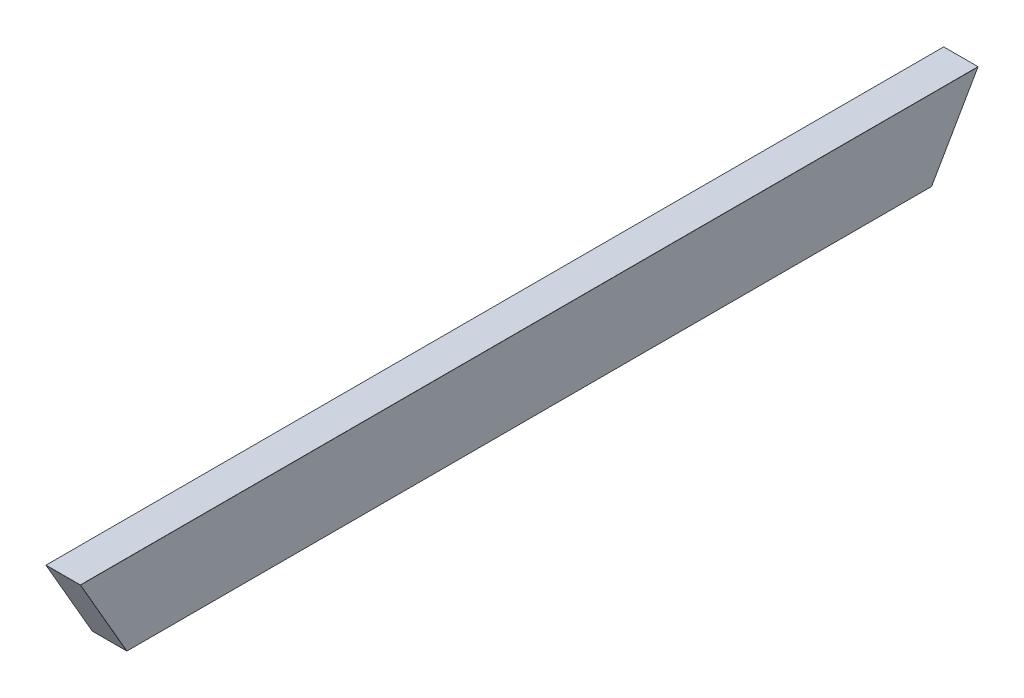
ISO-10303-21;
HEADER;
FILE_DESCRIPTION(('STEP AP214'),'2;1');
FILE_NAME('part.step','',(''),(''),'','','');
FILE_SCHEMA(('AUTOMOTIVE_DESIGN { 1 0 10303 214 1 1 1 1 }'));
ENDSEC;
DATA;
#1=APPLICATION_CONTEXT('core data for automotive mechanical design processes');
#2=APPLICATION_PROTOCOL_DEFINITION('international standard','automotive_design',2000,#1);
#3=PRODUCT_CONTEXT('',#1,'mechanical');
#4=PRODUCT('Part','Part','',(#3));
#5=PRODUCT_RELATED_PRODUCT_CATEGORY('part','',(#4));
#6=PRODUCT_DEFINITION_FORMATION('','',#4);
#7=PRODUCT_DEFINITION_CONTEXT('part definition',#1,'design');
#8=PRODUCT_DEFINITION('design','',#6,#7);
#9=PRODUCT_DEFINITION_SHAPE('','',#8);
#10=(LENGTH_UNIT() NAMED_UNIT(*) SI_UNIT(.MILLI.,.METRE.));
#11=(NAMED_UNIT(*) PLANE_ANGLE_UNIT() SI_UNIT($,.RADIAN.));
#12=(NAMED_UNIT(*) SI_UNIT($,.STERADIAN.) SOLID_ANGLE_UNIT());
#13=UNCERTAINTY_MEASURE_WITH_UNIT(LENGTH_MEASURE(1.E-05),#10,'distance_accuracy_value','');
#14=(GEOMETRIC_REPRESENTATION_CONTEXT(3) GLOBAL_UNCERTAINTY_ASSIGNED_CONTEXT((#13)) GLOBAL_UNIT_ASSIGNED_CONTEXT((#10,
#11,#12)) REPRESENTATION_CONTEXT('',''));
#15=CARTESIAN_POINT('',(0.,0.,0.));
#16=DIRECTION('',(0.,0.,1.));
#17=DIRECTION('',(1.,0.,0.));
#18=AXIS2_PLACEMENT_3D('',#15,#16,#17);
#19=CARTESIAN_POINT('',(-1.5,3.5,39.));
#20=DIRECTION('',(1.,0.,0.));
#21=DIRECTION('',(0.,1.,0.));
#22=AXIS2_PLACEMENT_3D('',#19,#20,#21);
#23=PLANE('',#22);
#24=DIRECTION('',(0.,0.,1.));
#25=VECTOR('',#24,1.);
#26=CARTESIAN_POINT('',(-1.5,-3.49,39.));
#27=LINE('',#26,#25);
#28=CARTESIAN_POINT('',(-1.5,-3.49,-34.9527746129807));
#29=VERTEX_POINT('',#28);
#30=CARTESIAN_POINT('',(-1.5,-3.49,34.9527746129807));
#31=VERTEX_POINT('',#30);
#32=EDGE_CURVE('E299',#29,#31,#27,.T.);
#33=ORIENTED_EDGE('',*,*,#32,.T.);
#34=DIRECTION('',(0.,0.866025403784438,0.500000000000001));
#35=VECTOR('',#34,1.);
#36=CARTESIAN_POINT('',(-1.5,3.505,38.9913397459622));
#37=LINE('',#36,#35);
#38=CARTESIAN_POINT('',(-1.5,3.49,38.9826794919243));
#39=VERTEX_POINT('',#38);
#40=EDGE_CURVE('E266',#31,#39,#37,.T.);
#41=ORIENTED_EDGE('',*,*,#40,.T.);
#42=DIRECTION('',(0.,0.,-1.));
#43=VECTOR('',#42,1.);
#44=CARTESIAN_POINT('',(-1.5,3.49,39.));
#45=LINE('',#44,#43);
#46=CARTESIAN_POINT('',(-1.5,3.49,-38.9826794919243));
#47=VERTEX_POINT('',#46);
#48=EDGE_CURVE('E342',#39,#47,#45,.T.);
#49=ORIENTED_EDGE('',*,*,#48,.T.);
#50=DIRECTION('',(0.,-0.866025403784438,0.500000000000001));
#51=VECTOR('',#50,1.);
#52=CARTESIAN_POINT('',(-1.5,-3.48499999999999,-34.9556613643267));
#53=LINE('',#52,#51);
#54=EDGE_CURVE('E264',#47,#29,#53,.T.);
#55=ORIENTED_EDGE('',*,*,#54,.T.);
#56=EDGE_LOOP('',(#33,#41,#49,#55));
#57=FACE_BOUND('',#56,.T.);
#58=ADVANCED_FACE('F34',(#57),#23,.F.);
#59=CARTESIAN_POINT('',(1.5,-3.5,39.));
#60=DIRECTION('',(0.,1.,0.));
#61=DIRECTION('',(0.,0.,1.));
#62=AXIS2_PLACEMENT_3D('',#59,#60,#61);
#63=PLANE('',#62);
#64=DIRECTION('',(0.,0.,1.));
#65=VECTOR('',#64,1.);
#66=CARTESIAN_POINT('',(1.49,-3.5,39.));
#67=LINE('',#66,#65);
#68=CARTESIAN_POINT('',(1.49,-3.5,-34.931227607597));
#69=VERTEX_POINT('',#68);
#70=CARTESIAN_POINT('',(1.49,-3.5,34.9485481156726));
#71=VERTEX_POINT('',#70);
#72=EDGE_CURVE('E345',#69,#71,#67,.T.);
#73=ORIENTED_EDGE('',*,*,#72,.T.);
#74=DIRECTION('',(-1.,0.,0.));
#75=VECTOR('',#74,1.);
#76=CARTESIAN_POINT('',(1.5,-3.5,34.9485481156726));
#77=LINE('',#76,#75);
#78=CARTESIAN_POINT('',(-1.49,-3.5,34.9485481156726));
#79=VERTEX_POINT('',#78);
#80=EDGE_CURVE('E251',#71,#79,#77,.T.);
#81=ORIENTED_EDGE('',*,*,#80,.T.);
#82=DIRECTION('',(0.,0.,-1.));
#83=VECTOR('',#82,1.);
#84=CARTESIAN_POINT('',(-1.49,-3.5,39.));
#85=LINE('',#84,#83);
#86=CARTESIAN_POINT('',(-1.49,-3.5,-34.931227607597));
#87=VERTEX_POINT('',#86);
#88=EDGE_CURVE('E353',#79,#87,#85,.T.);
#89=ORIENTED_EDGE('',*,*,#88,.T.);
#90=DIRECTION('',(1.,0.,0.));
#91=VECTOR('',#90,1.);
#92=CARTESIAN_POINT('',(1.49,-3.5,-34.931227607597));
#93=LINE('',#92,#91);
#94=EDGE_CURVE('E249',#87,#69,#93,.T.);
#95=ORIENTED_EDGE('',*,*,#94,.T.);
#96=EDGE_LOOP('',(#73,#81,#89,#95));
#97=FACE_BOUND('',#96,.T.);
#98=ADVANCED_FACE('F432',(#97),#63,.F.);
#99=CARTESIAN_POINT('',(1.5,3.5,39.));
#100=DIRECTION('',(-1.,0.,0.));
#101=DIRECTION('',(0.,-1.,0.));
#102=AXIS2_PLACEMENT_3D('',#99,#100,#101);
#103=PLANE('',#102);
#104=DIRECTION('',(0.,0.,1.));
#105=VECTOR('',#104,1.);
#106=CARTESIAN_POINT('',(1.5,3.49000000000001,39.));
#107=LINE('',#106,#105);
#108=CARTESIAN_POINT('',(1.5,3.49000000000001,-38.9826794919243));
#109=VERTEX_POINT('',#108);
#110=CARTESIAN_POINT('',(1.5,3.49000000000001,38.9826794919243));
#111=VERTEX_POINT('',#110);
#112=EDGE_CURVE('E204',#109,#111,#107,.T.);
#113=ORIENTED_EDGE('',*,*,#112,.T.);
#114=DIRECTION('',(0.,-0.866025403784438,-0.500000000000001));
#115=VECTOR('',#114,1.);
#116=CARTESIAN_POINT('',(1.5,3.505,38.9913397459622));
#117=LINE('',#116,#115);
#118=CARTESIAN_POINT('',(1.5,-3.49000000000001,34.9527746129807));
#119=VERTEX_POINT('',#118);
#120=EDGE_CURVE('E237',#111,#119,#117,.T.);
#121=ORIENTED_EDGE('',*,*,#120,.T.);
#122=DIRECTION('',(0.,0.,-1.));
#123=VECTOR('',#122,1.);
#124=CARTESIAN_POINT('',(1.5,-3.49000000000001,39.));
#125=LINE('',#124,#123);
#126=CARTESIAN_POINT('',(1.5,-3.49000000000001,-34.9527746129807));
#127=VERTEX_POINT('',#126);
#128=EDGE_CURVE('E356',#119,#127,#125,.T.);
#129=ORIENTED_EDGE('',*,*,#128,.T.);
#130=DIRECTION('',(0.,0.866025403784438,-0.500000000000001));
#131=VECTOR('',#130,1.);
#132=CARTESIAN_POINT('',(1.5,3.49500000000002,-38.9855662432703));
#133=LINE('',#132,#131);
#134=EDGE_CURVE('E235',#127,#109,#133,.T.);
#135=ORIENTED_EDGE('',*,*,#134,.T.);
#136=EDGE_LOOP('',(#113,#121,#129,#135));
#137=FACE_BOUND('',#136,.T.);
#138=ADVANCED_FACE('F377',(#137),#103,.F.);
#139=CARTESIAN_POINT('',(1.5,3.5,39.));
#140=DIRECTION('',(0.,-1.,0.));
#141=DIRECTION('',(1.,0.,0.));
#142=AXIS2_PLACEMENT_3D('',#139,#140,#141);
#143=PLANE('',#142);
#144=DIRECTION('',(1.,0.,0.));
#145=VECTOR('',#144,1.);
#146=CARTESIAN_POINT('',(1.5,3.5,38.99));
#147=LINE('',#146,#145);
#148=CARTESIAN_POINT('',(-1.48923868704155,3.5,38.99));
#149=VERTEX_POINT('',#148);
#150=CARTESIAN_POINT('',(1.48923868704155,3.5,38.99));
#151=VERTEX_POINT('',#150);
#152=EDGE_CURVE('E221',#149,#151,#147,.T.);
#153=ORIENTED_EDGE('',*,*,#152,.T.);
#154=DIRECTION('',(0.688816127388709,0.,-0.724936095562376));
#155=VECTOR('',#154,1.);
#156=CARTESIAN_POINT('',(1.4863609282737,3.5,38.9930286619639));
#157=LINE('',#156,#155);
#158=CARTESIAN_POINT('',(1.49000000000001,3.5,38.9891987655026));
#159=VERTEX_POINT('',#158);
#160=EDGE_CURVE('E191',#151,#159,#157,.T.);
#161=ORIENTED_EDGE('',*,*,#160,.T.);
#162=DIRECTION('',(0.,0.,-1.));
#163=VECTOR('',#162,1.);
#164=CARTESIAN_POINT('',(1.49000000000001,3.5,39.));
#165=LINE('',#164,#163);
#166=CARTESIAN_POINT('',(1.49000000000001,3.5,-38.9891987655026));
#167=VERTEX_POINT('',#166);
#168=EDGE_CURVE('E337',#159,#167,#165,.T.);
#169=ORIENTED_EDGE('',*,*,#168,.T.);
#170=DIRECTION('',(-0.68881612738852,0.,-0.724936095562555));
#171=VECTOR('',#170,1.);
#172=CARTESIAN_POINT('',(1.4863609282737,3.5,-38.9930286619639));
#173=LINE('',#172,#171);
#174=CARTESIAN_POINT('',(1.48669270090293,3.5,-38.9926794919243));
#175=VERTEX_POINT('',#174);
#176=EDGE_CURVE('E219',#167,#175,#173,.T.);
#177=ORIENTED_EDGE('',*,*,#176,.T.);
#178=DIRECTION('',(-1.,0.,0.));
#179=VECTOR('',#178,1.);
#180=CARTESIAN_POINT('',(-1.49000000000001,3.5,-38.9926794919243));
#181=LINE('',#180,#179);
#182=CARTESIAN_POINT('',(-1.4866927009029,3.5,-38.9926794919243));
#183=VERTEX_POINT('',#182);
#184=EDGE_CURVE('E212',#175,#183,#181,.T.);
#185=ORIENTED_EDGE('',*,*,#184,.T.);
#186=DIRECTION('',(-0.688816127388604,0.,0.724936095562476));
#187=VECTOR('',#186,1.);
#188=CARTESIAN_POINT('',(-0.50566156514202,3.5,-40.0251536935373));
#189=LINE('',#188,#187);
#190=CARTESIAN_POINT('',(-1.49,3.5,-38.9891987655026));
#191=VERTEX_POINT('',#190);
#192=EDGE_CURVE('E210',#183,#191,#189,.T.);
#193=ORIENTED_EDGE('',*,*,#192,.T.);
#194=DIRECTION('',(0.,0.,1.));
#195=VECTOR('',#194,1.);
#196=CARTESIAN_POINT('',(-1.49000000000001,3.5,39.));
#197=LINE('',#196,#195);
#198=CARTESIAN_POINT('',(-1.49000000000001,3.5,38.9891987655026));
#199=VERTEX_POINT('',#198);
#200=EDGE_CURVE('E341',#191,#199,#197,.T.);
#201=ORIENTED_EDGE('',*,*,#200,.T.);
#202=DIRECTION('',(0.688816127388745,0.,0.724936095562341));
#203=VECTOR('',#202,1.);
#204=CARTESIAN_POINT('',(-0.505661565141778,3.5,40.0251536935372));
#205=LINE('',#204,#203);
#206=EDGE_CURVE('E223',#199,#149,#205,.T.);
#207=ORIENTED_EDGE('',*,*,#206,.T.);
#208=EDGE_LOOP('',(#153,#161,#169,#177,#185,#193,#201,#207));
#209=FACE_BOUND('',#208,.T.);
#210=ADVANCED_FACE('F340',(#209),#143,.F.);
#211=CARTESIAN_POINT('',(1.5,3.5,39.));
#212=DIRECTION('',(0.,-0.500000000000001,0.866025403784438));
#213=DIRECTION('',(0.,-0.866025403784438,-0.500000000000001));
#214=AXIS2_PLACEMENT_3D('',#211,#212,#213);
#215=PLANE('',#214);
#216=DIRECTION('',(0.,-0.866025403784438,-0.500000000000001));
#217=VECTOR('',#216,1.);
#218=CARTESIAN_POINT('',(1.49,3.5,39.));
#219=LINE('',#218,#217);
#220=CARTESIAN_POINT('',(1.49,-3.47633974596215,34.9722083697105));
#221=VERTEX_POINT('',#220);
#222=CARTESIAN_POINT('',(1.49,3.48973693741692,38.994074618055));
#223=VERTEX_POINT('',#222);
#224=EDGE_CURVE('E208',#221,#223,#219,.F.);
#225=ORIENTED_EDGE('',*,*,#224,.T.);
#226=DIRECTION('',(0.654653670707977,-0.654653670707977,-0.377964473009228));
#227=VECTOR('',#226,1.);
#228=CARTESIAN_POINT('',(1.48413539280967,3.49560154460725,38.997460550595));
#229=LINE('',#228,#227);
#230=CARTESIAN_POINT('',(1.48607668337907,3.49366025403785,38.9963397459622));
#231=VERTEX_POINT('',#230);
#232=EDGE_CURVE('E189',#223,#231,#229,.F.);
#233=ORIENTED_EDGE('',*,*,#232,.T.);
#234=DIRECTION('',(1.,0.,0.));
#235=VECTOR('',#234,1.);
#236=CARTESIAN_POINT('',(1.5,3.49366025403785,38.9963397459622));
#237=LINE('',#236,#235);
#238=CARTESIAN_POINT('',(-1.48607668337908,3.49366025403785,38.9963397459622));
#239=VERTEX_POINT('',#238);
#240=EDGE_CURVE('E197',#231,#239,#237,.F.);
#241=ORIENTED_EDGE('',*,*,#240,.T.);
#242=DIRECTION('',(0.654653670707977,0.654653670707977,0.377964473009228));
#243=VECTOR('',#242,1.);
#244=CARTESIAN_POINT('',(-1.49413539280967,3.48560154460725,38.9916870479031));
#245=LINE('',#244,#243);
#246=CARTESIAN_POINT('',(-1.49,3.48973693741692,38.994074618055));
#247=VERTEX_POINT('',#246);
#248=EDGE_CURVE('E203',#239,#247,#245,.F.);
#249=ORIENTED_EDGE('',*,*,#248,.T.);
#250=DIRECTION('',(0.,0.866025403784438,0.500000000000001));
#251=VECTOR('',#250,1.);
#252=CARTESIAN_POINT('',(-1.49,3.5,39.));
#253=LINE('',#252,#251);
#254=CARTESIAN_POINT('',(-1.49,-3.47633974596215,34.9722083697105));
#255=VERTEX_POINT('',#254);
#256=EDGE_CURVE('E362',#247,#255,#253,.F.);
#257=ORIENTED_EDGE('',*,*,#256,.T.);
#258=DIRECTION('',(-1.,0.,0.));
#259=VECTOR('',#258,1.);
#260=CARTESIAN_POINT('',(1.5,-3.47633974596215,34.9722083697105));
#261=LINE('',#260,#259);
#262=EDGE_CURVE('E214',#255,#221,#261,.F.);
#263=ORIENTED_EDGE('',*,*,#262,.T.);
#264=EDGE_LOOP('',(#225,#233,#241,#249,#257,#263));
#265=FACE_BOUND('',#264,.T.);
#266=ADVANCED_FACE('F206',(#265),#215,.T.);
#267=CARTESIAN_POINT('',(1.5,3.5,-39.));
#268=DIRECTION('',(0.,-0.500000000000001,-0.866025403784438));
#269=DIRECTION('',(0.,0.866025403784438,-0.500000000000001));
#270=AXIS2_PLACEMENT_3D('',#267,#268,#269);
#271=PLANE('',#270);
#272=DIRECTION('',(-1.,0.,0.));
#273=VECTOR('',#272,1.);
#274=CARTESIAN_POINT('',(-1.49,-3.49133974596216,-34.9635481156726));
#275=LINE('',#274,#273);
#276=CARTESIAN_POINT('',(1.47592500016515,-3.49133974596216,-34.9635481156726));
#277=VERTEX_POINT('',#276);
#278=CARTESIAN_POINT('',(-1.47592500016565,-3.49133974596216,-34.9635481156726));
#279=VERTEX_POINT('',#278);
#280=EDGE_CURVE('E44',#277,#279,#275,.T.);
#281=ORIENTED_EDGE('',*,*,#280,.T.);
#282=DIRECTION('',(-0.654653670707977,0.654653670707977,-0.377964473009228));
#283=VECTOR('',#282,1.);
#284=CARTESIAN_POINT('',(-4.19557985493018,-0.771684891197627,-36.5337415781738));
#285=LINE('',#284,#283);
#286=CARTESIAN_POINT('',(-1.49,-3.4772647461278,-34.9716743206158));
#287=VERTEX_POINT('',#286);
#288=EDGE_CURVE('E11',#279,#287,#285,.T.);
#289=ORIENTED_EDGE('',*,*,#288,.T.);
#290=DIRECTION('',(0.,0.866025403784438,-0.500000000000001));
#291=VECTOR('',#290,1.);
#292=CARTESIAN_POINT('',(-1.49,3.49,-38.9942264973081));
#293=LINE('',#292,#291);
#294=CARTESIAN_POINT('',(-1.49,3.48973693741689,-38.9940746180549));
#295=VERTEX_POINT('',#294);
#296=EDGE_CURVE('E276',#287,#295,#293,.T.);
#297=ORIENTED_EDGE('',*,*,#296,.T.);
#298=DIRECTION('',(0.654653670707977,0.654653670707977,-0.377964473009228));
#299=VECTOR('',#298,1.);
#300=CARTESIAN_POINT('',(-0.202706821381083,4.77703011603581,-39.7372936812565));
#301=LINE('',#300,#299);
#302=CARTESIAN_POINT('',(-1.48839719145472,3.49133974596217,-38.995));
#303=VERTEX_POINT('',#302);
#304=EDGE_CURVE('E278',#295,#303,#301,.T.);
#305=ORIENTED_EDGE('',*,*,#304,.T.);
#306=DIRECTION('',(1.,0.,0.));
#307=VECTOR('',#306,1.);
#308=CARTESIAN_POINT('',(1.49000000000001,3.49133974596217,-38.995));
#309=LINE('',#308,#307);
#310=CARTESIAN_POINT('',(1.48839719145475,3.49133974596217,-38.995));
#311=VERTEX_POINT('',#310);
#312=EDGE_CURVE('E280',#303,#311,#309,.T.);
#313=ORIENTED_EDGE('',*,*,#312,.T.);
#314=DIRECTION('',(0.654653670707977,-0.654653670707977,0.377964473009228));
#315=VECTOR('',#314,1.);
#316=CARTESIAN_POINT('',(1.48842110709538,3.49131583032154,-38.9949861922984));
#317=LINE('',#316,#315);
#318=CARTESIAN_POINT('',(1.48999999999999,3.48973693741694,-38.994074618055));
#319=VERTEX_POINT('',#318);
#320=EDGE_CURVE('E282',#311,#319,#317,.T.);
#321=ORIENTED_EDGE('',*,*,#320,.T.);
#322=DIRECTION('',(0.,-0.866025403784438,0.500000000000001));
#323=VECTOR('',#322,1.);
#324=CARTESIAN_POINT('',(1.48999999999999,-3.49,-34.9643216183645));
#325=LINE('',#324,#323);
#326=CARTESIAN_POINT('',(1.48999999999999,-3.47726474612732,-34.9716743206161));
#327=VERTEX_POINT('',#326);
#328=EDGE_CURVE('E284',#319,#327,#325,.T.);
#329=ORIENTED_EDGE('',*,*,#328,.T.);
#330=DIRECTION('',(-0.654653670707993,-0.654653670707965,0.377964473009221));
#331=VECTOR('',#330,1.);
#332=CARTESIAN_POINT('',(5.4812941406442,0.514029394516722,-37.2760490671319));
#333=LINE('',#332,#331);
#334=EDGE_CURVE('E55',#327,#277,#333,.T.);
#335=ORIENTED_EDGE('',*,*,#334,.T.);
#336=EDGE_LOOP('',(#281,#289,#297,#305,#313,#321,#329,#335));
#337=FACE_BOUND('',#336,.T.);
#338=ADVANCED_FACE('F397',(#337),#271,.T.);
#339=CARTESIAN_POINT('',(-1.5,3.49,39.));
#340=DIRECTION('',(0.707106781186547,-0.707106781186547,0.));
#341=DIRECTION('',(0.,0.,-1.));
#342=AXIS2_PLACEMENT_3D('',#339,#340,#341);
#343=PLANE('',#342);
#344=ORIENTED_EDGE('',*,*,#48,.F.);
#345=DIRECTION('',(-0.447213595499978,-0.447213595499978,-0.774596669241461));
#346=VECTOR('',#345,1.);
#347=CARTESIAN_POINT('',(-1.494,3.496,38.9930717967697));
#348=LINE('',#347,#346);
#349=CARTESIAN_POINT('',(-1.49935414346695,3.49064585653305,38.983798148254));
#350=VERTEX_POINT('',#349);
#351=EDGE_CURVE('E274',#39,#350,#348,.F.);
#352=ORIENTED_EDGE('',*,*,#351,.T.);
#353=DIRECTION('',(-0.654653670707977,-0.654653670707977,-0.377964473009228));
#354=VECTOR('',#353,1.);
#355=CARTESIAN_POINT('',(-1.48732738758088,3.50267261241913,38.9907417990023));
#356=LINE('',#355,#354);
#357=EDGE_CURVE('E272',#350,#199,#356,.F.);
#358=ORIENTED_EDGE('',*,*,#357,.T.);
#359=ORIENTED_EDGE('',*,*,#200,.F.);
#360=DIRECTION('',(0.654653670707977,0.654653670707977,-0.377964473009228));
#361=VECTOR('',#360,1.);
#362=CARTESIAN_POINT('',(-20.7958935290627,-15.8058935290627,-27.842935939552));
#363=LINE('',#362,#361);
#364=CARTESIAN_POINT('',(-1.49935414346697,3.49064585653303,-38.9837981482539));
#365=VERTEX_POINT('',#364);
#366=EDGE_CURVE('E270',#191,#365,#363,.F.);
#367=ORIENTED_EDGE('',*,*,#366,.T.);
#368=DIRECTION('',(0.44721359549971,0.44721359549971,-0.774596669241769));
#369=VECTOR('',#368,1.);
#370=CARTESIAN_POINT('',(-28.5139925980695,-23.5239925980695,7.80692820326481));
#371=LINE('',#370,#369);
#372=EDGE_CURVE('E268',#365,#47,#371,.F.);
#373=ORIENTED_EDGE('',*,*,#372,.T.);
#374=EDGE_LOOP('',(#344,#352,#358,#359,#367,#373));
#375=FACE_BOUND('',#374,.T.);
#376=ADVANCED_FACE('F412',(#375),#343,.F.);
#377=CARTESIAN_POINT('',(-1.49,-3.5,39.));
#378=DIRECTION('',(0.707106781186547,0.707106781186547,0.));
#379=DIRECTION('',(0.,0.,-1.));
#380=AXIS2_PLACEMENT_3D('',#377,#378,#379);
#381=PLANE('',#380);
#382=ORIENTED_EDGE('',*,*,#88,.F.);
#383=DIRECTION('',(0.577350269189622,-0.577350269189622,-0.577350269189633));
#384=VECTOR('',#383,1.);
#385=CARTESIAN_POINT('',(-2.84048396144248,-2.14951603855753,36.2990320771151));
#386=LINE('',#385,#384);
#387=CARTESIAN_POINT('',(-1.49633974596216,-3.49366025403784,34.9548878616348));
#388=VERTEX_POINT('',#387);
#389=EDGE_CURVE('E262',#79,#388,#386,.F.);
#390=ORIENTED_EDGE('',*,*,#389,.T.);
#391=DIRECTION('',(0.654653670707998,-0.654653670707998,0.377964473009154));
#392=VECTOR('',#391,1.);
#393=CARTESIAN_POINT('',(-0.490000000000162,-4.49999999999984,35.535898384862));
#394=LINE('',#393,#392);
#395=EDGE_CURVE('E260',#388,#31,#394,.F.);
#396=ORIENTED_EDGE('',*,*,#395,.T.);
#397=ORIENTED_EDGE('',*,*,#32,.F.);
#398=DIRECTION('',(-0.654653670707719,0.654653670707719,0.377964473010122));
#399=VECTOR('',#398,1.);
#400=CARTESIAN_POINT('',(-19.7899947129464,14.7999947129464,-24.3930412419551));
#401=LINE('',#400,#399);
#402=CARTESIAN_POINT('',(-1.49935414346688,-3.49064585653312,-34.9531474984239));
#403=VERTEX_POINT('',#402);
#404=EDGE_CURVE('E253',#29,#403,#401,.F.);
#405=ORIENTED_EDGE('',*,*,#404,.T.);
#406=DIRECTION('',(-0.654653670707977,0.654653670707977,-0.377964473009228));
#407=VECTOR('',#406,1.);
#408=CARTESIAN_POINT('',(16.8073221004913,-21.7973221004913,-24.3837830410073));
#409=LINE('',#408,#407);
#410=CARTESIAN_POINT('',(-1.49523639989832,-3.49476360010169,-34.9507701180662));
#411=VERTEX_POINT('',#410);
#412=EDGE_CURVE('E255',#403,#411,#409,.F.);
#413=ORIENTED_EDGE('',*,*,#412,.T.);
#414=DIRECTION('',(-0.250562807085962,0.250562807085962,-0.935113126530906));
#415=VECTOR('',#414,1.);
#416=CARTESIAN_POINT('',(15.8324244887373,-20.8224244887373,29.7169406945777));
#417=LINE('',#416,#415);
#418=EDGE_CURVE('E258',#411,#87,#417,.F.);
#419=ORIENTED_EDGE('',*,*,#418,.T.);
#420=EDGE_LOOP('',(#382,#390,#396,#397,#405,#413,#419));
#421=FACE_BOUND('',#420,.T.);
#422=ADVANCED_FACE('F430',(#421),#381,.F.);
#423=CARTESIAN_POINT('',(1.49000000000001,3.5,39.));
#424=DIRECTION('',(-0.707106781186547,-0.707106781186547,0.));
#425=DIRECTION('',(0.,0.,-1.));
#426=AXIS2_PLACEMENT_3D('',#423,#424,#425);
#427=PLANE('',#426);
#428=ORIENTED_EDGE('',*,*,#168,.F.);
#429=DIRECTION('',(-0.654653670707977,0.654653670707977,0.377964473009228));
#430=VECTOR('',#429,1.);
#431=CARTESIAN_POINT('',(1.49732738758087,3.49267261241914,38.9849682963104));
#432=LINE('',#431,#430);
#433=CARTESIAN_POINT('',(1.49935414346695,3.49064585653306,38.983798148254));
#434=VERTEX_POINT('',#433);
#435=EDGE_CURVE('E232',#159,#434,#432,.F.);
#436=ORIENTED_EDGE('',*,*,#435,.T.);
#437=DIRECTION('',(-0.447213595499835,0.447213595499835,0.774596669241625));
#438=VECTOR('',#437,1.);
#439=CARTESIAN_POINT('',(1.49000000000001,3.5,39.));
#440=LINE('',#439,#438);
#441=EDGE_CURVE('E230',#434,#111,#440,.F.);
#442=ORIENTED_EDGE('',*,*,#441,.T.);
#443=ORIENTED_EDGE('',*,*,#112,.F.);
#444=DIRECTION('',(0.447213595499956,-0.447213595499956,0.774596669241485));
#445=VECTOR('',#444,1.);
#446=CARTESIAN_POINT('',(28.5099925980745,-23.5199925980744,7.80000000000022));
#447=LINE('',#446,#445);
#448=CARTESIAN_POINT('',(1.49935414346695,3.49064585653306,-38.983798148254));
#449=VERTEX_POINT('',#448);
#450=EDGE_CURVE('E228',#109,#449,#447,.F.);
#451=ORIENTED_EDGE('',*,*,#450,.T.);
#452=DIRECTION('',(0.654653670707977,-0.654653670707977,0.377964473009228));
#453=VECTOR('',#452,1.);
#454=CARTESIAN_POINT('',(20.7873221004913,-15.7973221004913,-27.8478846561451));
#455=LINE('',#454,#453);
#456=EDGE_CURVE('E226',#449,#167,#455,.F.);
#457=ORIENTED_EDGE('',*,*,#456,.T.);
#458=EDGE_LOOP('',(#428,#436,#442,#443,#451,#457));
#459=FACE_BOUND('',#458,.T.);
#460=ADVANCED_FACE('F336',(#459),#427,.F.);
#461=CARTESIAN_POINT('',(1.5,-3.49000000000001,39.));
#462=DIRECTION('',(-0.707106781186532,0.707106781186563,0.));
#463=DIRECTION('',(0.,0.,-1.));
#464=AXIS2_PLACEMENT_3D('',#461,#462,#463);
#465=PLANE('',#464);
#466=ORIENTED_EDGE('',*,*,#128,.F.);
#467=DIRECTION('',(0.654653670707857,0.654653670707829,-0.377964473009691));
#468=VECTOR('',#467,1.);
#469=CARTESIAN_POINT('',(0.498571428570378,-4.49142857142958,35.5309496682706));
#470=LINE('',#469,#468);
#471=CARTESIAN_POINT('',(1.49633974596216,-3.49366025403785,34.9548878616348));
#472=VERTEX_POINT('',#471);
#473=EDGE_CURVE('E247',#119,#472,#470,.F.);
#474=ORIENTED_EDGE('',*,*,#473,.T.);
#475=DIRECTION('',(0.577350269189639,0.577350269189614,0.577350269189624));
#476=VECTOR('',#475,1.);
#477=CARTESIAN_POINT('',(2.84715062810916,-2.1428493718909,36.3056987437817));
#478=LINE('',#477,#476);
#479=EDGE_CURVE('E245',#472,#71,#478,.F.);
#480=ORIENTED_EDGE('',*,*,#479,.T.);
#481=ORIENTED_EDGE('',*,*,#72,.F.);
#482=DIRECTION('',(-0.250562807085973,-0.250562807085962,0.935113126530903));
#483=VECTOR('',#482,1.);
#484=CARTESIAN_POINT('',(-15.831168854332,-20.8211688543313,29.7122546031788));
#485=LINE('',#484,#483);
#486=CARTESIAN_POINT('',(1.49523639989824,-3.49476360010176,-34.9507701180659));
#487=VERTEX_POINT('',#486);
#488=EDGE_CURVE('E243',#69,#487,#485,.F.);
#489=ORIENTED_EDGE('',*,*,#488,.T.);
#490=DIRECTION('',(-0.654653670707993,-0.654653670707965,0.377964473009221));
#491=VECTOR('',#490,1.);
#492=CARTESIAN_POINT('',(-16.7987506719199,-21.7887506719191,-24.3887317576006));
#493=LINE('',#492,#491);
#494=CARTESIAN_POINT('',(1.4993541434671,-3.49064585653291,-34.9531474984238));
#495=VERTEX_POINT('',#494);
#496=EDGE_CURVE('E241',#487,#495,#493,.F.);
#497=ORIENTED_EDGE('',*,*,#496,.T.);
#498=DIRECTION('',(-0.654653670707984,-0.654653670707956,-0.377964473009252));
#499=VECTOR('',#498,1.);
#500=CARTESIAN_POINT('',(19.7985661414832,14.8085661414824,-24.3880925254106));
#501=LINE('',#500,#499);
#502=EDGE_CURVE('E239',#495,#127,#501,.F.);
#503=ORIENTED_EDGE('',*,*,#502,.T.);
#504=EDGE_LOOP('',(#466,#474,#480,#481,#489,#497,#503));
#505=FACE_BOUND('',#504,.T.);
#506=ADVANCED_FACE('F380',(#505),#465,.F.);
#507=CARTESIAN_POINT('',(-1.49000000000001,3.5,39.));
#508=DIRECTION('',(-0.707106781186508,-0.353553390593294,0.612372435695828));
#509=DIRECTION('',(0.,0.866025403784438,0.500000000000001));
#510=AXIS2_PLACEMENT_3D('',#507,#508,#509);
#511=PLANE('',#510);
#512=ORIENTED_EDGE('',*,*,#40,.F.);
#513=ORIENTED_EDGE('',*,*,#395,.F.);
#514=DIRECTION('',(0.250562807085765,0.684550319445285,0.684550319445298));
#515=VECTOR('',#514,1.);
#516=CARTESIAN_POINT('',(0.397459971375945,1.68029679308866,40.1288449087614));
#517=LINE('',#516,#515);
#518=EDGE_CURVE('E296',#255,#388,#517,.F.);
#519=ORIENTED_EDGE('',*,*,#518,.F.);
#520=ORIENTED_EDGE('',*,*,#256,.F.);
#521=DIRECTION('',(0.671706153596231,-0.0652680350246847,0.737936939599159));
#522=VECTOR('',#521,1.);
#523=CARTESIAN_POINT('',(-0.59722698566401,3.40298837920168,39.9748757949217));
#524=LINE('',#523,#522);
#525=EDGE_CURVE('E293',#350,#247,#524,.T.);
#526=ORIENTED_EDGE('',*,*,#525,.F.);
#527=ORIENTED_EDGE('',*,*,#351,.F.);
#528=EDGE_LOOP('',(#512,#513,#519,#520,#526,#527));
#529=FACE_BOUND('',#528,.T.);
#530=ADVANCED_FACE('F421',(#529),#511,.T.);
#531=CARTESIAN_POINT('',(1.5,-3.47633974596215,34.9722083697105));
#532=DIRECTION('',(0.,-0.707106781186554,0.707106781186541));
#533=DIRECTION('',(-1.,0.,0.));
#534=AXIS2_PLACEMENT_3D('',#531,#532,#533);
#535=PLANE('',#534);
#536=ORIENTED_EDGE('',*,*,#80,.F.);
#537=ORIENTED_EDGE('',*,*,#479,.F.);
#538=DIRECTION('',(-0.250562807085578,0.68455031944532,0.684550319445332));
#539=VECTOR('',#538,1.);
#540=CARTESIAN_POINT('',(1.49062781720295,-3.47805497445846,34.9704931412141));
#541=LINE('',#540,#539);
#542=EDGE_CURVE('E290',#221,#472,#541,.F.);
#543=ORIENTED_EDGE('',*,*,#542,.F.);
#544=ORIENTED_EDGE('',*,*,#262,.F.);
#545=ORIENTED_EDGE('',*,*,#518,.T.);
#546=ORIENTED_EDGE('',*,*,#389,.F.);
#547=EDGE_LOOP('',(#536,#537,#543,#544,#545,#546));
#548=FACE_BOUND('',#547,.T.);
#549=ADVANCED_FACE('F370',(#548),#535,.T.);
#550=CARTESIAN_POINT('',(-0.202706821381094,4.77703011603582,39.7372936812565));
#551=DIRECTION('',(-0.688982236504545,0.311017763495241,0.654653670708118));
#552=DIRECTION('',(0.654653670707977,0.654653670707977,0.377964473009228));
#553=AXIS2_PLACEMENT_3D('',#550,#551,#552);
#554=PLANE('',#553);
#555=ORIENTED_EDGE('',*,*,#525,.T.);
#556=ORIENTED_EDGE('',*,*,#248,.F.);
#557=DIRECTION('',(0.332597463363687,-0.666850405774439,0.666850405775169));
#558=VECTOR('',#557,1.);
#559=CARTESIAN_POINT('',(-1.15575367769045,2.83137008455685,39.6586299154439));
#560=LINE('',#559,#558);
#561=EDGE_CURVE('E200',#149,#239,#560,.T.);
#562=ORIENTED_EDGE('',*,*,#561,.F.);
#563=ORIENTED_EDGE('',*,*,#206,.F.);
#564=ORIENTED_EDGE('',*,*,#357,.F.);
#565=EDGE_LOOP('',(#555,#556,#562,#563,#564));
#566=FACE_BOUND('',#565,.T.);
#567=ADVANCED_FACE('F426',(#566),#554,.T.);
#568=CARTESIAN_POINT('',(1.49,3.5,39.));
#569=DIRECTION('',(0.707106781186789,-0.353553390593154,0.612372435695585));
#570=DIRECTION('',(0.,-0.866025403784438,-0.500000000000001));
#571=AXIS2_PLACEMENT_3D('',#568,#569,#570);
#572=PLANE('',#571);
#573=ORIENTED_EDGE('',*,*,#120,.F.);
#574=ORIENTED_EDGE('',*,*,#441,.F.);
#575=DIRECTION('',(-0.67170615359605,-0.0652680350251804,0.73793693959928));
#576=VECTOR('',#575,1.);
#577=CARTESIAN_POINT('',(1.4875128680564,3.48949526892254,38.996806983279));
#578=LINE('',#577,#576);
#579=EDGE_CURVE('E194',#223,#434,#578,.F.);
#580=ORIENTED_EDGE('',*,*,#579,.F.);
#581=ORIENTED_EDGE('',*,*,#224,.F.);
#582=ORIENTED_EDGE('',*,*,#542,.T.);
#583=ORIENTED_EDGE('',*,*,#473,.F.);
#584=EDGE_LOOP('',(#573,#574,#580,#581,#582,#583));
#585=FACE_BOUND('',#584,.T.);
#586=ADVANCED_FACE('F374',(#585),#572,.T.);
#587=CARTESIAN_POINT('',(1.5,3.49366025403785,38.9963397459622));
#588=DIRECTION('',(0.,0.707106781186934,0.707106781186161));
#589=DIRECTION('',(1.,0.,0.));
#590=AXIS2_PLACEMENT_3D('',#587,#588,#589);
#591=PLANE('',#590);
#592=ORIENTED_EDGE('',*,*,#561,.T.);
#593=ORIENTED_EDGE('',*,*,#240,.F.);
#594=DIRECTION('',(0.332597463363603,0.66685040577446,-0.66685040577519));
#595=VECTOR('',#594,1.);
#596=CARTESIAN_POINT('',(1.48761689559833,3.49674834476772,38.9932516552323));
#597=LINE('',#596,#595);
#598=EDGE_CURVE('E185',#151,#231,#597,.F.);
#599=ORIENTED_EDGE('',*,*,#598,.F.);
#600=ORIENTED_EDGE('',*,*,#152,.F.);
#601=EDGE_LOOP('',(#592,#593,#599,#600));
#602=FACE_BOUND('',#601,.T.);
#603=ADVANCED_FACE('F198',(#602),#591,.T.);
#604=CARTESIAN_POINT('',(1.48842110709539,3.49131583032154,38.9949861922984));
#605=DIRECTION('',(0.688982236504568,0.311017763495284,0.654653670708074));
#606=DIRECTION('',(0.654653670707977,-0.654653670707977,-0.377964473009228));
#607=AXIS2_PLACEMENT_3D('',#604,#605,#606);
#608=PLANE('',#607);
#609=ORIENTED_EDGE('',*,*,#579,.T.);
#610=ORIENTED_EDGE('',*,*,#435,.F.);
#611=ORIENTED_EDGE('',*,*,#160,.F.);
#612=ORIENTED_EDGE('',*,*,#598,.T.);
#613=ORIENTED_EDGE('',*,*,#232,.F.);
#614=EDGE_LOOP('',(#609,#610,#611,#612,#613));
#615=FACE_BOUND('',#614,.T.);
#616=ADVANCED_FACE('F187',(#615),#608,.T.);
#617=CARTESIAN_POINT('',(1.48842110709539,3.49131583032154,-38.9949861922984));
#618=DIRECTION('',(0.688982236504681,0.311017763495529,-0.654653670707839));
#619=DIRECTION('',(-0.654653670707977,0.654653670707977,-0.377964473009228));
#620=AXIS2_PLACEMENT_3D('',#617,#618,#619);
#621=PLANE('',#620);
#622=ORIENTED_EDGE('',*,*,#176,.F.);
#623=ORIENTED_EDGE('',*,*,#456,.F.);
#624=DIRECTION('',(-0.671706153596096,-0.0652680350243006,-0.737936939599316));
#625=VECTOR('',#624,1.);
#626=CARTESIAN_POINT('',(1.48890499460326,3.48963053843547,-38.9952775918955));
#627=LINE('',#626,#625);
#628=EDGE_CURVE('E39',#319,#449,#627,.F.);
#629=ORIENTED_EDGE('',*,*,#628,.F.);
#630=ORIENTED_EDGE('',*,*,#320,.F.);
#631=DIRECTION('',(0.186766099054579,-0.948929791212214,-0.254264971228596));
#632=VECTOR('',#631,1.);
#633=CARTESIAN_POINT('',(1.48715688046449,3.49764157512167,-38.9933114299659));
#634=LINE('',#633,#632);
#635=EDGE_CURVE('E315',#175,#311,#634,.T.);
#636=ORIENTED_EDGE('',*,*,#635,.F.);
#637=EDGE_LOOP('',(#622,#623,#629,#630,#636));
#638=FACE_BOUND('',#637,.T.);
#639=ADVANCED_FACE('F37',(#638),#621,.T.);
#640=CARTESIAN_POINT('',(1.5,-30.2699907475931,-19.4913397459621));
#641=DIRECTION('',(0.70710678118655,-0.353553390593273,-0.612372435695792));
#642=DIRECTION('',(0.,-0.866025403784438,0.500000000000001));
#643=AXIS2_PLACEMENT_3D('',#640,#641,#642);
#644=PLANE('',#643);
#645=ORIENTED_EDGE('',*,*,#134,.F.);
#646=ORIENTED_EDGE('',*,*,#502,.F.);
#647=DIRECTION('',(-0.378801154138973,0.541875382083054,-0.750253794335841));
#648=VECTOR('',#647,1.);
#649=CARTESIAN_POINT('',(11.3904554543081,-17.6398749269064,-15.3628262770261));
#650=LINE('',#649,#648);
#651=EDGE_CURVE('E313',#327,#495,#650,.F.);
#652=ORIENTED_EDGE('',*,*,#651,.F.);
#653=ORIENTED_EDGE('',*,*,#328,.F.);
#654=ORIENTED_EDGE('',*,*,#628,.T.);
#655=ORIENTED_EDGE('',*,*,#450,.F.);
#656=EDGE_LOOP('',(#645,#646,#652,#653,#654,#655));
#657=FACE_BOUND('',#656,.T.);
#658=ADVANCED_FACE('F327',(#657),#644,.T.);
#659=CARTESIAN_POINT('',(1.5,3.5,-38.9926794919243));
#660=DIRECTION('',(0.,0.258819045101998,-0.965925826289208));
#661=DIRECTION('',(1.,0.,0.));
#662=AXIS2_PLACEMENT_3D('',#659,#660,#661);
#663=PLANE('',#662);
#664=ORIENTED_EDGE('',*,*,#635,.T.);
#665=ORIENTED_EDGE('',*,*,#312,.F.);
#666=DIRECTION('',(-0.186766099054391,-0.948929791212249,-0.254264971228605));
#667=VECTOR('',#666,1.);
#668=CARTESIAN_POINT('',(-1.25094016064395,4.69782235608257,-38.6717239589368));
#669=LINE('',#668,#667);
#670=EDGE_CURVE('E310',#183,#303,#669,.T.);
#671=ORIENTED_EDGE('',*,*,#670,.F.);
#672=ORIENTED_EDGE('',*,*,#184,.F.);
#673=EDGE_LOOP('',(#664,#665,#671,#672));
#674=FACE_BOUND('',#673,.T.);
#675=ADVANCED_FACE('F523',(#674),#663,.T.);
#676=CARTESIAN_POINT('',(5.48129414064443,0.514029394516551,-37.2760490671318));
#677=DIRECTION('',(0.311017763495655,-0.688982236504764,-0.654653670707692));
#678=DIRECTION('',(0.654653670707993,0.654653670707965,-0.377964473009221));
#679=AXIS2_PLACEMENT_3D('',#676,#677,#678);
#680=PLANE('',#679);
#681=ORIENTED_EDGE('',*,*,#651,.T.);
#682=ORIENTED_EDGE('',*,*,#496,.F.);
#683=DIRECTION('',(-0.824994684921651,0.146269121149474,-0.545883791707709));
#684=VECTOR('',#683,1.);
#685=CARTESIAN_POINT('',(2.67727371363191,-3.70433532487249,-34.1686377933925));
#686=LINE('',#685,#684);
#687=EDGE_CURVE('E307',#277,#487,#686,.F.);
#688=ORIENTED_EDGE('',*,*,#687,.F.);
#689=ORIENTED_EDGE('',*,*,#334,.F.);
#690=EDGE_LOOP('',(#681,#682,#688,#689));
#691=FACE_BOUND('',#690,.T.);
#692=ADVANCED_FACE('F385',(#691),#680,.T.);
#693=CARTESIAN_POINT('',(-0.202706821381101,4.77703011603582,-39.7372936812565));
#694=DIRECTION('',(-0.688982236504634,0.311017763495407,-0.654653670707946));
#695=DIRECTION('',(-0.654653670707977,-0.654653670707977,0.377964473009228));
#696=AXIS2_PLACEMENT_3D('',#693,#694,#695);
#697=PLANE('',#696);
#698=ORIENTED_EDGE('',*,*,#670,.T.);
#699=ORIENTED_EDGE('',*,*,#304,.F.);
#700=DIRECTION('',(0.671706153595855,-0.065268035025463,-0.737936939599433));
#701=VECTOR('',#700,1.);
#702=CARTESIAN_POINT('',(-9.68150655691224,4.28568548427141,-29.9948786944257));
#703=LINE('',#702,#701);
#704=EDGE_CURVE('E304',#365,#295,#703,.T.);
#705=ORIENTED_EDGE('',*,*,#704,.F.);
#706=ORIENTED_EDGE('',*,*,#366,.F.);
#707=ORIENTED_EDGE('',*,*,#192,.F.);
#708=EDGE_LOOP('',(#698,#699,#705,#706,#707));
#709=FACE_BOUND('',#708,.T.);
#710=ADVANCED_FACE('F402',(#709),#697,.T.);
#711=CARTESIAN_POINT('',(1.50000000000001,-3.5,-34.931227607597));
#712=DIRECTION('',(0.,-0.965925826289,-0.258819045102775));
#713=DIRECTION('',(-1.,0.,0.));
#714=AXIS2_PLACEMENT_3D('',#711,#712,#713);
#715=PLANE('',#714);
#716=ORIENTED_EDGE('',*,*,#94,.F.);
#717=ORIENTED_EDGE('',*,*,#418,.F.);
#718=DIRECTION('',(0.824994684922022,0.146269121149334,-0.545883791707187));
#719=VECTOR('',#718,1.);
#720=CARTESIAN_POINT('',(0.533937230535608,-3.13499710825935,-36.2934369444812));
#721=LINE('',#720,#719);
#722=EDGE_CURVE('E302',#279,#411,#721,.F.);
#723=ORIENTED_EDGE('',*,*,#722,.F.);
#724=ORIENTED_EDGE('',*,*,#280,.F.);
#725=ORIENTED_EDGE('',*,*,#687,.T.);
#726=ORIENTED_EDGE('',*,*,#488,.F.);
#727=EDGE_LOOP('',(#716,#717,#723,#724,#725,#726));
#728=FACE_BOUND('',#727,.T.);
#729=ADVANCED_FACE('F389',(#728),#715,.T.);
#730=CARTESIAN_POINT('',(-1.5,-30.2699907475931,-19.4913397459621));
#731=DIRECTION('',(-0.707106781187036,-0.35355339059303,-0.612372435695371));
#732=DIRECTION('',(0.,0.866025403784438,-0.500000000000001));
#733=AXIS2_PLACEMENT_3D('',#730,#731,#732);
#734=PLANE('',#733);
#735=ORIENTED_EDGE('',*,*,#704,.T.);
#736=ORIENTED_EDGE('',*,*,#296,.F.);
#737=DIRECTION('',(-0.378801154137901,-0.541875382083961,0.750253794335727));
#738=VECTOR('',#737,1.);
#739=CARTESIAN_POINT('',(-11.3904554542885,-17.6398749269425,-15.3628262770122));
#740=LINE('',#739,#738);
#741=EDGE_CURVE('E300',#403,#287,#740,.F.);
#742=ORIENTED_EDGE('',*,*,#741,.F.);
#743=ORIENTED_EDGE('',*,*,#404,.F.);
#744=ORIENTED_EDGE('',*,*,#54,.F.);
#745=ORIENTED_EDGE('',*,*,#372,.F.);
#746=EDGE_LOOP('',(#735,#736,#742,#743,#744,#745));
#747=FACE_BOUND('',#746,.T.);
#748=ADVANCED_FACE('F407',(#747),#734,.T.);
#749=CARTESIAN_POINT('',(-4.19557985493011,-0.771684891197577,-36.5337415781738));
#750=DIRECTION('',(-0.311017763495418,-0.68898223650462,-0.654653670707956));
#751=DIRECTION('',(0.654653670707977,-0.654653670707977,0.377964473009228));
#752=AXIS2_PLACEMENT_3D('',#749,#750,#751);
#753=PLANE('',#752);
#754=ORIENTED_EDGE('',*,*,#722,.T.);
#755=ORIENTED_EDGE('',*,*,#412,.F.);
#756=ORIENTED_EDGE('',*,*,#741,.T.);
#757=ORIENTED_EDGE('',*,*,#288,.F.);
#758=EDGE_LOOP('',(#754,#755,#756,#757));
#759=FACE_BOUND('',#758,.T.);
#760=ADVANCED_FACE('F394',(#759),#753,.T.);
#761=CLOSED_SHELL('',(#58,#98,#138,#210,#266,#338,#376,#422,#460,#506,#530,#549,#567,#586,#603,
#616,#639,#658,#675,#692,#710,#729,#748,#760));
#762=MANIFOLD_SOLID_BREP('B2',#761);
#763=ADVANCED_BREP_SHAPE_REPRESENTATION('',(#18,#762),#14);
#764=SHAPE_DEFINITION_REPRESENTATION(#9,#763);
ENDSEC;
END-ISO-10303-21;
